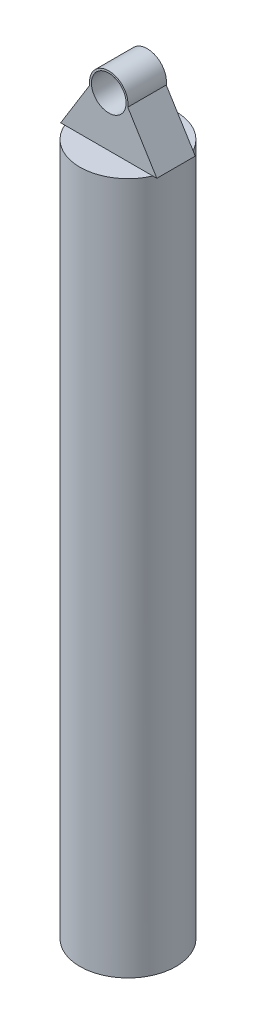
ISO-10303-21;
HEADER;
FILE_DESCRIPTION(('STEP AP214'),'2;1');
FILE_NAME('part.step','',(''),(''),'','','');
FILE_SCHEMA(('AUTOMOTIVE_DESIGN { 1 0 10303 214 1 1 1 1 }'));
ENDSEC;
DATA;
#1=APPLICATION_CONTEXT('core data for automotive mechanical design processes');
#2=APPLICATION_PROTOCOL_DEFINITION('international standard','automotive_design',2000,#1);
#3=PRODUCT_CONTEXT('',#1,'mechanical');
#4=PRODUCT('Part','Part','',(#3));
#5=PRODUCT_RELATED_PRODUCT_CATEGORY('part','',(#4));
#6=PRODUCT_DEFINITION_FORMATION('','',#4);
#7=PRODUCT_DEFINITION_CONTEXT('part definition',#1,'design');
#8=PRODUCT_DEFINITION('design','',#6,#7);
#9=PRODUCT_DEFINITION_SHAPE('','',#8);
#10=(LENGTH_UNIT() NAMED_UNIT(*) SI_UNIT(.MILLI.,.METRE.));
#11=(NAMED_UNIT(*) PLANE_ANGLE_UNIT() SI_UNIT($,.RADIAN.));
#12=(NAMED_UNIT(*) SI_UNIT($,.STERADIAN.) SOLID_ANGLE_UNIT());
#13=UNCERTAINTY_MEASURE_WITH_UNIT(LENGTH_MEASURE(1.E-05),#10,'distance_accuracy_value','');
#14=(GEOMETRIC_REPRESENTATION_CONTEXT(3) GLOBAL_UNCERTAINTY_ASSIGNED_CONTEXT((#13)) GLOBAL_UNIT_ASSIGNED_CONTEXT((#10,
#11,#12)) REPRESENTATION_CONTEXT('',''));
#15=CARTESIAN_POINT('',(0.,0.,0.));
#16=DIRECTION('',(0.,0.,1.));
#17=DIRECTION('',(1.,0.,0.));
#18=AXIS2_PLACEMENT_3D('',#15,#16,#17);
#19=CARTESIAN_POINT('',(0.,1400.,0.));
#20=DIRECTION('',(0.,1.,0.));
#21=DIRECTION('',(0.,0.,1.));
#22=AXIS2_PLACEMENT_3D('',#19,#20,#21);
#23=PLANE('',#22);
#24=CARTESIAN_POINT('',(0.,1400.,0.));
#25=DIRECTION('',(0.,1.,0.));
#26=DIRECTION('',(0.,0.,1.));
#27=AXIS2_PLACEMENT_3D('',#24,#25,#26);
#28=CIRCLE('',#27,125.);
#29=CARTESIAN_POINT('',(114.564392373896,1400.,-50.));
#30=VERTEX_POINT('',#29);
#31=CARTESIAN_POINT('',(-114.564392373896,1400.,-50.));
#32=VERTEX_POINT('',#31);
#33=EDGE_CURVE('E139',#30,#32,#28,.T.);
#34=ORIENTED_EDGE('',*,*,#33,.T.);
#35=DIRECTION('',(1.,0.,0.));
#36=VECTOR('',#35,1.);
#37=CARTESIAN_POINT('',(0.,1400.,-50.));
#38=LINE('',#37,#36);
#39=EDGE_CURVE('E11',#32,#30,#38,.T.);
#40=ORIENTED_EDGE('',*,*,#39,.T.);
#41=EDGE_LOOP('',(#34,#40));
#42=FACE_BOUND('',#41,.T.);
#43=ADVANCED_FACE('F35',(#42),#23,.T.);
#44=CARTESIAN_POINT('',(0.,-400.,0.));
#45=DIRECTION('',(0.,1.,0.));
#46=DIRECTION('',(0.,0.,1.));
#47=AXIS2_PLACEMENT_3D('',#44,#45,#46);
#48=CYLINDRICAL_SURFACE('',#47,125.);
#49=CARTESIAN_POINT('',(0.,-400.,0.));
#50=DIRECTION('',(0.,1.,0.));
#51=DIRECTION('',(0.,0.,1.));
#52=AXIS2_PLACEMENT_3D('',#49,#50,#51);
#53=CIRCLE('',#52,125.);
#54=CARTESIAN_POINT('',(0.,-400.,125.));
#55=VERTEX_POINT('',#54);
#56=EDGE_CURVE('E39',#55,#55,#53,.T.);
#57=ORIENTED_EDGE('',*,*,#56,.T.);
#58=EDGE_LOOP('',(#57));
#59=FACE_BOUND('',#58,.T.);
#60=CARTESIAN_POINT('',(114.564392373896,1400.,50.));
#61=VERTEX_POINT('',#60);
#62=CARTESIAN_POINT('',(125.,1400.,0.));
#63=VERTEX_POINT('',#62);
#64=EDGE_CURVE('E127',#61,#63,#28,.T.);
#65=ORIENTED_EDGE('',*,*,#64,.F.);
#66=CARTESIAN_POINT('',(-114.564392373896,1400.,50.));
#67=VERTEX_POINT('',#66);
#68=EDGE_CURVE('E125',#67,#61,#28,.T.);
#69=ORIENTED_EDGE('',*,*,#68,.F.);
#70=CARTESIAN_POINT('',(-125.,1400.,0.));
#71=VERTEX_POINT('',#70);
#72=EDGE_CURVE('E59',#71,#67,#28,.T.);
#73=ORIENTED_EDGE('',*,*,#72,.F.);
#74=EDGE_CURVE('E144',#32,#71,#28,.T.);
#75=ORIENTED_EDGE('',*,*,#74,.F.);
#76=ORIENTED_EDGE('',*,*,#33,.F.);
#77=EDGE_CURVE('E132',#63,#30,#28,.T.);
#78=ORIENTED_EDGE('',*,*,#77,.F.);
#79=EDGE_LOOP('',(#65,#69,#73,#75,#76,#78));
#80=FACE_BOUND('',#79,.T.);
#81=ADVANCED_FACE('F37',(#59,#80),#48,.T.);
#82=CARTESIAN_POINT('',(0.,-400.,0.));
#83=DIRECTION('',(0.,1.,0.));
#84=DIRECTION('',(0.,0.,1.));
#85=AXIS2_PLACEMENT_3D('',#82,#83,#84);
#86=PLANE('',#85);
#87=ORIENTED_EDGE('',*,*,#56,.F.);
#88=EDGE_LOOP('',(#87));
#89=FACE_BOUND('',#88,.T.);
#90=ADVANCED_FACE('F195',(#89),#86,.F.);
#91=DIRECTION('',(1.,0.,0.));
#92=VECTOR('',#91,1.);
#93=CARTESIAN_POINT('',(0.,1400.,50.));
#94=LINE('',#93,#92);
#95=EDGE_CURVE('E44',#67,#61,#94,.T.);
#96=ORIENTED_EDGE('',*,*,#95,.F.);
#97=ORIENTED_EDGE('',*,*,#68,.T.);
#98=EDGE_LOOP('',(#96,#97));
#99=FACE_BOUND('',#98,.T.);
#100=ADVANCED_FACE('F191',(#99),#23,.T.);
#101=CARTESIAN_POINT('',(0.,1400.,50.));
#102=DIRECTION('',(0.,1.,0.));
#103=DIRECTION('',(0.,0.,1.));
#104=AXIS2_PLACEMENT_3D('',#101,#102,#103);
#105=PLANE('',#104);
#106=CARTESIAN_POINT('',(125.,1400.,50.));
#107=VERTEX_POINT('',#106);
#108=EDGE_CURVE('E110',#61,#107,#94,.T.);
#109=ORIENTED_EDGE('',*,*,#108,.F.);
#110=ORIENTED_EDGE('',*,*,#64,.T.);
#111=DIRECTION('',(0.,0.,-1.));
#112=VECTOR('',#111,1.);
#113=CARTESIAN_POINT('',(125.,1400.,50.));
#114=LINE('',#113,#112);
#115=EDGE_CURVE('E169',#107,#63,#114,.T.);
#116=ORIENTED_EDGE('',*,*,#115,.F.);
#117=EDGE_LOOP('',(#109,#110,#116));
#118=FACE_BOUND('',#117,.T.);
#119=ADVANCED_FACE('F186',(#118),#105,.F.);
#120=CARTESIAN_POINT('',(125.,1400.,-50.));
#121=VERTEX_POINT('',#120);
#122=EDGE_CURVE('E168',#63,#121,#114,.T.);
#123=ORIENTED_EDGE('',*,*,#122,.F.);
#124=ORIENTED_EDGE('',*,*,#77,.T.);
#125=EDGE_CURVE('E47',#30,#121,#38,.T.);
#126=ORIENTED_EDGE('',*,*,#125,.T.);
#127=EDGE_LOOP('',(#123,#124,#126));
#128=FACE_BOUND('',#127,.T.);
#129=ADVANCED_FACE('F174',(#128),#105,.F.);
#130=CARTESIAN_POINT('',(-125.,1400.,-50.));
#131=VERTEX_POINT('',#130);
#132=EDGE_CURVE('E46',#131,#32,#38,.T.);
#133=ORIENTED_EDGE('',*,*,#132,.T.);
#134=ORIENTED_EDGE('',*,*,#74,.T.);
#135=DIRECTION('',(0.,0.,-1.));
#136=VECTOR('',#135,1.);
#137=CARTESIAN_POINT('',(-125.,1400.,50.));
#138=LINE('',#137,#136);
#139=EDGE_CURVE('E128',#71,#131,#138,.T.);
#140=ORIENTED_EDGE('',*,*,#139,.T.);
#141=EDGE_LOOP('',(#133,#134,#140));
#142=FACE_BOUND('',#141,.T.);
#143=ADVANCED_FACE('F179',(#142),#105,.F.);
#144=CARTESIAN_POINT('',(-125.,1400.,50.));
#145=VERTEX_POINT('',#144);
#146=EDGE_CURVE('E106',#145,#71,#138,.T.);
#147=ORIENTED_EDGE('',*,*,#146,.T.);
#148=ORIENTED_EDGE('',*,*,#72,.T.);
#149=EDGE_CURVE('E152',#145,#67,#94,.T.);
#150=ORIENTED_EDGE('',*,*,#149,.F.);
#151=EDGE_LOOP('',(#147,#148,#150));
#152=FACE_BOUND('',#151,.T.);
#153=ADVANCED_FACE('F151',(#152),#105,.F.);
#154=CARTESIAN_POINT('',(0.,1529.52088678137,50.));
#155=DIRECTION('',(0.,0.,-1.));
#156=DIRECTION('',(-1.,0.,0.));
#157=AXIS2_PLACEMENT_3D('',#154,#155,#156);
#158=CYLINDRICAL_SURFACE('',#157,50.);
#159=CARTESIAN_POINT('',(0.,1529.52088678137,-50.));
#160=DIRECTION('',(0.,0.,1.));
#161=DIRECTION('',(1.,0.,0.));
#162=AXIS2_PLACEMENT_3D('',#159,#160,#161);
#163=CIRCLE('',#162,50.);
#164=CARTESIAN_POINT('',(49.4728208574024,1522.27934023306,-50.));
#165=VERTEX_POINT('',#164);
#166=CARTESIAN_POINT('',(-49.4728208574024,1522.27934023306,-50.));
#167=VERTEX_POINT('',#166);
#168=EDGE_CURVE('E124',#165,#167,#163,.T.);
#169=ORIENTED_EDGE('',*,*,#168,.T.);
#170=DIRECTION('',(0.,0.,-1.));
#171=VECTOR('',#170,1.);
#172=CARTESIAN_POINT('',(-49.4728208574024,1522.27934023306,50.));
#173=LINE('',#172,#171);
#174=CARTESIAN_POINT('',(-49.4728208574024,1522.27934023306,50.));
#175=VERTEX_POINT('',#174);
#176=EDGE_CURVE('E102',#175,#167,#173,.T.);
#177=ORIENTED_EDGE('',*,*,#176,.F.);
#178=CARTESIAN_POINT('',(0.,1529.52088678137,50.));
#179=DIRECTION('',(0.,0.,1.));
#180=DIRECTION('',(1.,0.,0.));
#181=AXIS2_PLACEMENT_3D('',#178,#179,#180);
#182=CIRCLE('',#181,50.);
#183=CARTESIAN_POINT('',(49.4728208574024,1522.27934023306,50.));
#184=VERTEX_POINT('',#183);
#185=EDGE_CURVE('E111',#184,#175,#182,.T.);
#186=ORIENTED_EDGE('',*,*,#185,.F.);
#187=DIRECTION('',(0.,0.,-1.));
#188=VECTOR('',#187,1.);
#189=CARTESIAN_POINT('',(49.4728208574024,1522.27934023306,50.));
#190=LINE('',#189,#188);
#191=EDGE_CURVE('E159',#184,#165,#190,.T.);
#192=ORIENTED_EDGE('',*,*,#191,.T.);
#193=EDGE_LOOP('',(#169,#177,#186,#192));
#194=FACE_BOUND('',#193,.T.);
#195=ADVANCED_FACE('F122',(#194),#158,.T.);
#196=CARTESIAN_POINT('',(-716.41095670636,442.499105439665,50.));
#197=DIRECTION('',(0.850792695701285,-0.525501464261842,0.));
#198=DIRECTION('',(0.525501464261842,0.850792695701285,0.));
#199=AXIS2_PLACEMENT_3D('',#196,#197,#198);
#200=PLANE('',#199);
#201=DIRECTION('',(-0.525501464261842,-0.850792695701285,0.));
#202=VECTOR('',#201,1.);
#203=CARTESIAN_POINT('',(-716.41095670636,442.499105439665,-50.));
#204=LINE('',#203,#202);
#205=EDGE_CURVE('E161',#167,#131,#204,.T.);
#206=ORIENTED_EDGE('',*,*,#205,.T.);
#207=ORIENTED_EDGE('',*,*,#139,.F.);
#208=ORIENTED_EDGE('',*,*,#146,.F.);
#209=DIRECTION('',(-0.525501464261842,-0.850792695701285,0.));
#210=VECTOR('',#209,1.);
#211=CARTESIAN_POINT('',(-716.41095670636,442.499105439665,50.));
#212=LINE('',#211,#210);
#213=EDGE_CURVE('E97',#175,#145,#212,.T.);
#214=ORIENTED_EDGE('',*,*,#213,.F.);
#215=ORIENTED_EDGE('',*,*,#176,.T.);
#216=EDGE_LOOP('',(#206,#207,#208,#214,#215));
#217=FACE_BOUND('',#216,.T.);
#218=ADVANCED_FACE('F100',(#217),#200,.F.);
#219=CARTESIAN_POINT('',(716.41095670636,442.499105439665,50.));
#220=DIRECTION('',(0.850792695701285,0.525501464261842,0.));
#221=DIRECTION('',(-0.525501464261842,0.850792695701285,0.));
#222=AXIS2_PLACEMENT_3D('',#219,#220,#221);
#223=PLANE('',#222);
#224=DIRECTION('',(0.525501464261842,-0.850792695701285,0.));
#225=VECTOR('',#224,1.);
#226=CARTESIAN_POINT('',(716.41095670636,442.499105439665,-50.));
#227=LINE('',#226,#225);
#228=EDGE_CURVE('E163',#165,#121,#227,.T.);
#229=ORIENTED_EDGE('',*,*,#228,.F.);
#230=ORIENTED_EDGE('',*,*,#191,.F.);
#231=DIRECTION('',(0.525501464261842,-0.850792695701285,0.));
#232=VECTOR('',#231,1.);
#233=CARTESIAN_POINT('',(716.41095670636,442.499105439665,50.));
#234=LINE('',#233,#232);
#235=EDGE_CURVE('E118',#184,#107,#234,.T.);
#236=ORIENTED_EDGE('',*,*,#235,.T.);
#237=ORIENTED_EDGE('',*,*,#115,.T.);
#238=ORIENTED_EDGE('',*,*,#122,.T.);
#239=EDGE_LOOP('',(#229,#230,#236,#237,#238));
#240=FACE_BOUND('',#239,.T.);
#241=ADVANCED_FACE('F173',(#240),#223,.T.);
#242=CARTESIAN_POINT('',(0.,1529.52088678137,50.));
#243=DIRECTION('',(0.,0.,-1.));
#244=DIRECTION('',(-1.,0.,0.));
#245=AXIS2_PLACEMENT_3D('',#242,#243,#244);
#246=CYLINDRICAL_SURFACE('',#245,45.);
#247=CARTESIAN_POINT('',(0.,1529.52088678137,50.));
#248=DIRECTION('',(0.,0.,1.));
#249=DIRECTION('',(1.,0.,0.));
#250=AXIS2_PLACEMENT_3D('',#247,#248,#249);
#251=CIRCLE('',#250,45.);
#252=CARTESIAN_POINT('',(45.,1529.52088678137,50.));
#253=VERTEX_POINT('',#252);
#254=EDGE_CURVE('E154',#253,#253,#251,.T.);
#255=ORIENTED_EDGE('',*,*,#254,.T.);
#256=EDGE_LOOP('',(#255));
#257=FACE_BOUND('',#256,.T.);
#258=CARTESIAN_POINT('',(0.,1529.52088678137,-50.));
#259=DIRECTION('',(0.,0.,1.));
#260=DIRECTION('',(1.,0.,0.));
#261=AXIS2_PLACEMENT_3D('',#258,#259,#260);
#262=CIRCLE('',#261,45.);
#263=CARTESIAN_POINT('',(45.,1529.52088678137,-50.));
#264=VERTEX_POINT('',#263);
#265=EDGE_CURVE('E120',#264,#264,#262,.T.);
#266=ORIENTED_EDGE('',*,*,#265,.F.);
#267=EDGE_LOOP('',(#266));
#268=FACE_BOUND('',#267,.T.);
#269=ADVANCED_FACE('F262',(#257,#268),#246,.F.);
#270=CARTESIAN_POINT('',(0.,0.,50.));
#271=DIRECTION('',(0.,0.,1.));
#272=DIRECTION('',(1.,0.,0.));
#273=AXIS2_PLACEMENT_3D('',#270,#271,#272);
#274=PLANE('',#273);
#275=ORIENTED_EDGE('',*,*,#185,.T.);
#276=ORIENTED_EDGE('',*,*,#213,.T.);
#277=ORIENTED_EDGE('',*,*,#149,.T.);
#278=ORIENTED_EDGE('',*,*,#95,.T.);
#279=ORIENTED_EDGE('',*,*,#108,.T.);
#280=ORIENTED_EDGE('',*,*,#235,.F.);
#281=EDGE_LOOP('',(#275,#276,#277,#278,#279,#280));
#282=FACE_BOUND('',#281,.T.);
#283=ORIENTED_EDGE('',*,*,#254,.F.);
#284=EDGE_LOOP('',(#283));
#285=FACE_BOUND('',#284,.T.);
#286=ADVANCED_FACE('F115',(#282,#285),#274,.T.);
#287=CARTESIAN_POINT('',(0.,0.,-50.));
#288=DIRECTION('',(0.,0.,1.));
#289=DIRECTION('',(1.,0.,0.));
#290=AXIS2_PLACEMENT_3D('',#287,#288,#289);
#291=PLANE('',#290);
#292=ORIENTED_EDGE('',*,*,#168,.F.);
#293=ORIENTED_EDGE('',*,*,#228,.T.);
#294=ORIENTED_EDGE('',*,*,#125,.F.);
#295=ORIENTED_EDGE('',*,*,#39,.F.);
#296=ORIENTED_EDGE('',*,*,#132,.F.);
#297=ORIENTED_EDGE('',*,*,#205,.F.);
#298=EDGE_LOOP('',(#292,#293,#294,#295,#296,#297));
#299=FACE_BOUND('',#298,.T.);
#300=ORIENTED_EDGE('',*,*,#265,.T.);
#301=EDGE_LOOP('',(#300));
#302=FACE_BOUND('',#301,.T.);
#303=ADVANCED_FACE('F176',(#299,#302),#291,.F.);
#304=CLOSED_SHELL('',(#43,#81,#90,#100,#119,#129,#143,#153,#195,#218,#241,#269,#286,#303));
#305=MANIFOLD_SOLID_BREP('B2',#304);
#306=ADVANCED_BREP_SHAPE_REPRESENTATION('',(#18,#305),#14);
#307=SHAPE_DEFINITION_REPRESENTATION(#9,#306);
ENDSEC;
END-ISO-10303-21;
